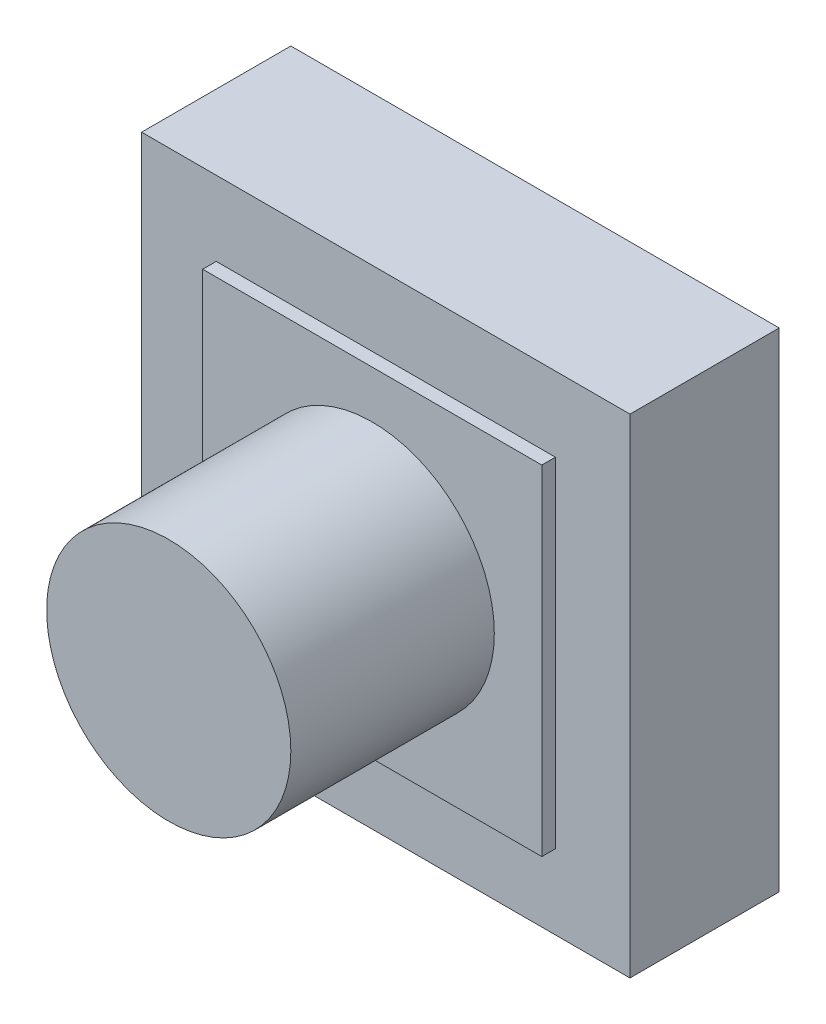
ISO-10303-21;
HEADER;
FILE_DESCRIPTION(('STEP AP214'),'2;1');
FILE_NAME('part.step','',(''),(''),'','','');
FILE_SCHEMA(('AUTOMOTIVE_DESIGN { 1 0 10303 214 1 1 1 1 }'));
ENDSEC;
DATA;
#1=APPLICATION_CONTEXT('core data for automotive mechanical design processes');
#2=APPLICATION_PROTOCOL_DEFINITION('international standard','automotive_design',2000,#1);
#3=PRODUCT_CONTEXT('',#1,'mechanical');
#4=PRODUCT('Part','Part','',(#3));
#5=PRODUCT_RELATED_PRODUCT_CATEGORY('part','',(#4));
#6=PRODUCT_DEFINITION_FORMATION('','',#4);
#7=PRODUCT_DEFINITION_CONTEXT('part definition',#1,'design');
#8=PRODUCT_DEFINITION('design','',#6,#7);
#9=PRODUCT_DEFINITION_SHAPE('','',#8);
#10=(LENGTH_UNIT() NAMED_UNIT(*) SI_UNIT(.MILLI.,.METRE.));
#11=(NAMED_UNIT(*) PLANE_ANGLE_UNIT() SI_UNIT($,.RADIAN.));
#12=(NAMED_UNIT(*) SI_UNIT($,.STERADIAN.) SOLID_ANGLE_UNIT());
#13=UNCERTAINTY_MEASURE_WITH_UNIT(LENGTH_MEASURE(1.E-05),#10,'distance_accuracy_value','');
#14=(GEOMETRIC_REPRESENTATION_CONTEXT(3) GLOBAL_UNCERTAINTY_ASSIGNED_CONTEXT((#13)) GLOBAL_UNIT_ASSIGNED_CONTEXT((#10,
#11,#12)) REPRESENTATION_CONTEXT('',''));
#15=CARTESIAN_POINT('',(0.,0.,0.));
#16=DIRECTION('',(0.,0.,1.));
#17=DIRECTION('',(1.,0.,0.));
#18=AXIS2_PLACEMENT_3D('',#15,#16,#17);
#19=CARTESIAN_POINT('',(0.,0.,11.));
#20=DIRECTION('',(0.,0.,-1.));
#21=DIRECTION('',(-1.,0.,0.));
#22=AXIS2_PLACEMENT_3D('',#19,#20,#21);
#23=PLANE('',#22);
#24=DIRECTION('',(0.,1.,0.));
#25=VECTOR('',#24,1.);
#26=CARTESIAN_POINT('',(18.,-18.,11.));
#27=LINE('',#26,#25);
#28=CARTESIAN_POINT('',(18.,-18.,11.));
#29=VERTEX_POINT('',#28);
#30=CARTESIAN_POINT('',(18.,18.,11.));
#31=VERTEX_POINT('',#30);
#32=EDGE_CURVE('E146',#29,#31,#27,.T.);
#33=ORIENTED_EDGE('',*,*,#32,.T.);
#34=DIRECTION('',(-1.,0.,0.));
#35=VECTOR('',#34,1.);
#36=CARTESIAN_POINT('',(-18.,18.,11.));
#37=LINE('',#36,#35);
#38=CARTESIAN_POINT('',(-18.,18.,11.));
#39=VERTEX_POINT('',#38);
#40=EDGE_CURVE('E150',#31,#39,#37,.T.);
#41=ORIENTED_EDGE('',*,*,#40,.T.);
#42=DIRECTION('',(0.,-1.,0.));
#43=VECTOR('',#42,1.);
#44=CARTESIAN_POINT('',(-18.,-18.,11.));
#45=LINE('',#44,#43);
#46=CARTESIAN_POINT('',(-18.,-18.,11.));
#47=VERTEX_POINT('',#46);
#48=EDGE_CURVE('E154',#39,#47,#45,.T.);
#49=ORIENTED_EDGE('',*,*,#48,.T.);
#50=DIRECTION('',(1.,0.,0.));
#51=VECTOR('',#50,1.);
#52=CARTESIAN_POINT('',(-18.,-18.,11.));
#53=LINE('',#52,#51);
#54=EDGE_CURVE('E157',#47,#29,#53,.T.);
#55=ORIENTED_EDGE('',*,*,#54,.T.);
#56=EDGE_LOOP('',(#33,#41,#49,#55));
#57=FACE_BOUND('',#56,.T.);
#58=DIRECTION('',(0.,1.,0.));
#59=VECTOR('',#58,1.);
#60=CARTESIAN_POINT('',(12.5,-12.5,11.));
#61=LINE('',#60,#59);
#62=CARTESIAN_POINT('',(12.5,-12.5,11.));
#63=VERTEX_POINT('',#62);
#64=CARTESIAN_POINT('',(12.5,12.5,11.));
#65=VERTEX_POINT('',#64);
#66=EDGE_CURVE('E62',#63,#65,#61,.T.);
#67=ORIENTED_EDGE('',*,*,#66,.F.);
#68=DIRECTION('',(1.,0.,0.));
#69=VECTOR('',#68,1.);
#70=CARTESIAN_POINT('',(-12.5,-12.5,11.));
#71=LINE('',#70,#69);
#72=CARTESIAN_POINT('',(-12.5,-12.5,11.));
#73=VERTEX_POINT('',#72);
#74=EDGE_CURVE('E66',#73,#63,#71,.T.);
#75=ORIENTED_EDGE('',*,*,#74,.F.);
#76=DIRECTION('',(0.,-1.,0.));
#77=VECTOR('',#76,1.);
#78=CARTESIAN_POINT('',(-12.5,-12.5,11.));
#79=LINE('',#78,#77);
#80=CARTESIAN_POINT('',(-12.5,12.5,11.));
#81=VERTEX_POINT('',#80);
#82=EDGE_CURVE('E356',#81,#73,#79,.T.);
#83=ORIENTED_EDGE('',*,*,#82,.F.);
#84=DIRECTION('',(-1.,0.,0.));
#85=VECTOR('',#84,1.);
#86=CARTESIAN_POINT('',(-12.5,12.5,11.));
#87=LINE('',#86,#85);
#88=EDGE_CURVE('E346',#65,#81,#87,.T.);
#89=ORIENTED_EDGE('',*,*,#88,.F.);
#90=EDGE_LOOP('',(#67,#75,#83,#89));
#91=FACE_BOUND('',#90,.T.);
#92=ADVANCED_FACE('F45',(#57,#91),#23,.F.);
#93=CARTESIAN_POINT('',(18.,-18.,11.));
#94=DIRECTION('',(-1.,0.,0.));
#95=DIRECTION('',(0.,0.,1.));
#96=AXIS2_PLACEMENT_3D('',#93,#94,#95);
#97=PLANE('',#96);
#98=DIRECTION('',(0.,1.,0.));
#99=VECTOR('',#98,1.);
#100=CARTESIAN_POINT('',(18.,-18.,0.));
#101=LINE('',#100,#99);
#102=CARTESIAN_POINT('',(18.,-18.,0.));
#103=VERTEX_POINT('',#102);
#104=CARTESIAN_POINT('',(18.,18.,0.));
#105=VERTEX_POINT('',#104);
#106=EDGE_CURVE('E135',#103,#105,#101,.T.);
#107=ORIENTED_EDGE('',*,*,#106,.T.);
#108=DIRECTION('',(0.,0.,-1.));
#109=VECTOR('',#108,1.);
#110=CARTESIAN_POINT('',(18.,18.,11.));
#111=LINE('',#110,#109);
#112=EDGE_CURVE('E49',#31,#105,#111,.T.);
#113=ORIENTED_EDGE('',*,*,#112,.F.);
#114=ORIENTED_EDGE('',*,*,#32,.F.);
#115=DIRECTION('',(0.,0.,-1.));
#116=VECTOR('',#115,1.);
#117=CARTESIAN_POINT('',(18.,-18.,11.));
#118=LINE('',#117,#116);
#119=EDGE_CURVE('E159',#29,#103,#118,.T.);
#120=ORIENTED_EDGE('',*,*,#119,.T.);
#121=EDGE_LOOP('',(#107,#113,#114,#120));
#122=FACE_BOUND('',#121,.T.);
#123=ADVANCED_FACE('F47',(#122),#97,.F.);
#124=CARTESIAN_POINT('',(-18.,18.,11.));
#125=DIRECTION('',(0.,-1.,0.));
#126=DIRECTION('',(0.,0.,-1.));
#127=AXIS2_PLACEMENT_3D('',#124,#125,#126);
#128=PLANE('',#127);
#129=DIRECTION('',(-1.,0.,0.));
#130=VECTOR('',#129,1.);
#131=CARTESIAN_POINT('',(-18.,18.,0.));
#132=LINE('',#131,#130);
#133=CARTESIAN_POINT('',(-18.,18.,0.));
#134=VERTEX_POINT('',#133);
#135=EDGE_CURVE('E140',#105,#134,#132,.T.);
#136=ORIENTED_EDGE('',*,*,#135,.T.);
#137=DIRECTION('',(0.,0.,-1.));
#138=VECTOR('',#137,1.);
#139=CARTESIAN_POINT('',(-18.,18.,11.));
#140=LINE('',#139,#138);
#141=EDGE_CURVE('E174',#39,#134,#140,.T.);
#142=ORIENTED_EDGE('',*,*,#141,.F.);
#143=ORIENTED_EDGE('',*,*,#40,.F.);
#144=ORIENTED_EDGE('',*,*,#112,.T.);
#145=EDGE_LOOP('',(#136,#142,#143,#144));
#146=FACE_BOUND('',#145,.T.);
#147=ADVANCED_FACE('F185',(#146),#128,.F.);
#148=CARTESIAN_POINT('',(-18.,-18.,11.));
#149=DIRECTION('',(1.,0.,0.));
#150=DIRECTION('',(0.,0.,-1.));
#151=AXIS2_PLACEMENT_3D('',#148,#149,#150);
#152=PLANE('',#151);
#153=DIRECTION('',(0.,-1.,0.));
#154=VECTOR('',#153,1.);
#155=CARTESIAN_POINT('',(-18.,-18.,0.));
#156=LINE('',#155,#154);
#157=CARTESIAN_POINT('',(-18.,-18.,0.));
#158=VERTEX_POINT('',#157);
#159=EDGE_CURVE('E163',#134,#158,#156,.T.);
#160=ORIENTED_EDGE('',*,*,#159,.T.);
#161=DIRECTION('',(0.,0.,-1.));
#162=VECTOR('',#161,1.);
#163=CARTESIAN_POINT('',(-18.,-18.,11.));
#164=LINE('',#163,#162);
#165=EDGE_CURVE('E171',#47,#158,#164,.T.);
#166=ORIENTED_EDGE('',*,*,#165,.F.);
#167=ORIENTED_EDGE('',*,*,#48,.F.);
#168=ORIENTED_EDGE('',*,*,#141,.T.);
#169=EDGE_LOOP('',(#160,#166,#167,#168));
#170=FACE_BOUND('',#169,.T.);
#171=ADVANCED_FACE('F194',(#170),#152,.F.);
#172=CARTESIAN_POINT('',(-18.,-18.,11.));
#173=DIRECTION('',(0.,1.,0.));
#174=DIRECTION('',(0.,0.,1.));
#175=AXIS2_PLACEMENT_3D('',#172,#173,#174);
#176=PLANE('',#175);
#177=DIRECTION('',(1.,0.,0.));
#178=VECTOR('',#177,1.);
#179=CARTESIAN_POINT('',(-18.,-18.,0.));
#180=LINE('',#179,#178);
#181=EDGE_CURVE('E151',#158,#103,#180,.T.);
#182=ORIENTED_EDGE('',*,*,#181,.T.);
#183=ORIENTED_EDGE('',*,*,#119,.F.);
#184=ORIENTED_EDGE('',*,*,#54,.F.);
#185=ORIENTED_EDGE('',*,*,#165,.T.);
#186=EDGE_LOOP('',(#182,#183,#184,#185));
#187=FACE_BOUND('',#186,.T.);
#188=ADVANCED_FACE('F197',(#187),#176,.F.);
#189=CARTESIAN_POINT('',(0.,0.,0.));
#190=DIRECTION('',(0.,0.,-1.));
#191=DIRECTION('',(-1.,0.,0.));
#192=AXIS2_PLACEMENT_3D('',#189,#190,#191);
#193=PLANE('',#192);
#194=ORIENTED_EDGE('',*,*,#106,.F.);
#195=ORIENTED_EDGE('',*,*,#181,.F.);
#196=ORIENTED_EDGE('',*,*,#159,.F.);
#197=ORIENTED_EDGE('',*,*,#135,.F.);
#198=EDGE_LOOP('',(#194,#195,#196,#197));
#199=FACE_BOUND('',#198,.T.);
#200=ADVANCED_FACE('F192',(#199),#193,.T.);
#201=CARTESIAN_POINT('',(12.5,-12.5,12.));
#202=DIRECTION('',(-1.,0.,0.));
#203=DIRECTION('',(0.,0.,1.));
#204=AXIS2_PLACEMENT_3D('',#201,#202,#203);
#205=PLANE('',#204);
#206=ORIENTED_EDGE('',*,*,#66,.T.);
#207=DIRECTION('',(0.,0.,-1.));
#208=VECTOR('',#207,1.);
#209=CARTESIAN_POINT('',(12.5,12.5,12.));
#210=LINE('',#209,#208);
#211=CARTESIAN_POINT('',(12.5,12.5,12.));
#212=VERTEX_POINT('',#211);
#213=EDGE_CURVE('E115',#212,#65,#210,.T.);
#214=ORIENTED_EDGE('',*,*,#213,.F.);
#215=DIRECTION('',(0.,1.,0.));
#216=VECTOR('',#215,1.);
#217=CARTESIAN_POINT('',(12.5,-12.5,12.));
#218=LINE('',#217,#216);
#219=CARTESIAN_POINT('',(12.5,-12.5,12.));
#220=VERTEX_POINT('',#219);
#221=EDGE_CURVE('E122',#220,#212,#218,.T.);
#222=ORIENTED_EDGE('',*,*,#221,.F.);
#223=DIRECTION('',(0.,0.,-1.));
#224=VECTOR('',#223,1.);
#225=CARTESIAN_POINT('',(12.5,-12.5,12.));
#226=LINE('',#225,#224);
#227=EDGE_CURVE('E352',#220,#63,#226,.T.);
#228=ORIENTED_EDGE('',*,*,#227,.T.);
#229=EDGE_LOOP('',(#206,#214,#222,#228));
#230=FACE_BOUND('',#229,.T.);
#231=ADVANCED_FACE('F133',(#230),#205,.F.);
#232=CARTESIAN_POINT('',(-12.5,12.5,12.));
#233=DIRECTION('',(0.,-1.,0.));
#234=DIRECTION('',(0.,0.,-1.));
#235=AXIS2_PLACEMENT_3D('',#232,#233,#234);
#236=PLANE('',#235);
#237=ORIENTED_EDGE('',*,*,#88,.T.);
#238=DIRECTION('',(0.,0.,-1.));
#239=VECTOR('',#238,1.);
#240=CARTESIAN_POINT('',(-12.5,12.5,12.));
#241=LINE('',#240,#239);
#242=CARTESIAN_POINT('',(-12.5,12.5,12.));
#243=VERTEX_POINT('',#242);
#244=EDGE_CURVE('E117',#243,#81,#241,.T.);
#245=ORIENTED_EDGE('',*,*,#244,.F.);
#246=DIRECTION('',(-1.,0.,0.));
#247=VECTOR('',#246,1.);
#248=CARTESIAN_POINT('',(-12.5,12.5,12.));
#249=LINE('',#248,#247);
#250=EDGE_CURVE('E110',#212,#243,#249,.T.);
#251=ORIENTED_EDGE('',*,*,#250,.F.);
#252=ORIENTED_EDGE('',*,*,#213,.T.);
#253=EDGE_LOOP('',(#237,#245,#251,#252));
#254=FACE_BOUND('',#253,.T.);
#255=ADVANCED_FACE('F113',(#254),#236,.F.);
#256=CARTESIAN_POINT('',(-12.5,-12.5,12.));
#257=DIRECTION('',(1.,0.,0.));
#258=DIRECTION('',(0.,0.,-1.));
#259=AXIS2_PLACEMENT_3D('',#256,#257,#258);
#260=PLANE('',#259);
#261=ORIENTED_EDGE('',*,*,#82,.T.);
#262=DIRECTION('',(0.,0.,-1.));
#263=VECTOR('',#262,1.);
#264=CARTESIAN_POINT('',(-12.5,-12.5,12.));
#265=LINE('',#264,#263);
#266=CARTESIAN_POINT('',(-12.5,-12.5,12.));
#267=VERTEX_POINT('',#266);
#268=EDGE_CURVE('E142',#267,#73,#265,.T.);
#269=ORIENTED_EDGE('',*,*,#268,.F.);
#270=DIRECTION('',(0.,-1.,0.));
#271=VECTOR('',#270,1.);
#272=CARTESIAN_POINT('',(-12.5,-12.5,12.));
#273=LINE('',#272,#271);
#274=EDGE_CURVE('E121',#243,#267,#273,.T.);
#275=ORIENTED_EDGE('',*,*,#274,.F.);
#276=ORIENTED_EDGE('',*,*,#244,.T.);
#277=EDGE_LOOP('',(#261,#269,#275,#276));
#278=FACE_BOUND('',#277,.T.);
#279=ADVANCED_FACE('F240',(#278),#260,.F.);
#280=CARTESIAN_POINT('',(-12.5,-12.5,12.));
#281=DIRECTION('',(0.,1.,0.));
#282=DIRECTION('',(0.,0.,1.));
#283=AXIS2_PLACEMENT_3D('',#280,#281,#282);
#284=PLANE('',#283);
#285=ORIENTED_EDGE('',*,*,#74,.T.);
#286=ORIENTED_EDGE('',*,*,#227,.F.);
#287=DIRECTION('',(1.,0.,0.));
#288=VECTOR('',#287,1.);
#289=CARTESIAN_POINT('',(-12.5,-12.5,12.));
#290=LINE('',#289,#288);
#291=EDGE_CURVE('E127',#267,#220,#290,.T.);
#292=ORIENTED_EDGE('',*,*,#291,.F.);
#293=ORIENTED_EDGE('',*,*,#268,.T.);
#294=EDGE_LOOP('',(#285,#286,#292,#293));
#295=FACE_BOUND('',#294,.T.);
#296=ADVANCED_FACE('F246',(#295),#284,.F.);
#297=CARTESIAN_POINT('',(0.,0.,12.));
#298=DIRECTION('',(0.,0.,-1.));
#299=DIRECTION('',(-1.,0.,0.));
#300=AXIS2_PLACEMENT_3D('',#297,#298,#299);
#301=PLANE('',#300);
#302=CARTESIAN_POINT('',(0.,0.,12.));
#303=DIRECTION('',(0.,0.,1.));
#304=DIRECTION('',(1.,0.,0.));
#305=AXIS2_PLACEMENT_3D('',#302,#303,#304);
#306=CIRCLE('',#305,9.);
#307=CARTESIAN_POINT('',(9.,0.,12.));
#308=VERTEX_POINT('',#307);
#309=EDGE_CURVE('E11',#308,#308,#306,.T.);
#310=ORIENTED_EDGE('',*,*,#309,.F.);
#311=EDGE_LOOP('',(#310));
#312=FACE_BOUND('',#311,.T.);
#313=ORIENTED_EDGE('',*,*,#221,.T.);
#314=ORIENTED_EDGE('',*,*,#250,.T.);
#315=ORIENTED_EDGE('',*,*,#274,.T.);
#316=ORIENTED_EDGE('',*,*,#291,.T.);
#317=EDGE_LOOP('',(#313,#314,#315,#316));
#318=FACE_BOUND('',#317,.T.);
#319=ADVANCED_FACE('F125',(#312,#318),#301,.F.);
#320=CARTESIAN_POINT('',(0.,0.,27.));
#321=DIRECTION('',(0.,0.,-1.));
#322=DIRECTION('',(-1.,0.,0.));
#323=AXIS2_PLACEMENT_3D('',#320,#321,#322);
#324=CYLINDRICAL_SURFACE('',#323,9.);
#325=CARTESIAN_POINT('',(0.,0.,27.));
#326=DIRECTION('',(0.,0.,1.));
#327=DIRECTION('',(1.,0.,0.));
#328=AXIS2_PLACEMENT_3D('',#325,#326,#327);
#329=CIRCLE('',#328,9.);
#330=CARTESIAN_POINT('',(9.,0.,27.));
#331=VERTEX_POINT('',#330);
#332=EDGE_CURVE('E342',#331,#331,#329,.T.);
#333=ORIENTED_EDGE('',*,*,#332,.F.);
#334=EDGE_LOOP('',(#333));
#335=FACE_BOUND('',#334,.T.);
#336=ORIENTED_EDGE('',*,*,#309,.T.);
#337=EDGE_LOOP('',(#336));
#338=FACE_BOUND('',#337,.T.);
#339=ADVANCED_FACE('F262',(#335,#338),#324,.T.);
#340=CARTESIAN_POINT('',(0.,0.,27.));
#341=DIRECTION('',(0.,0.,1.));
#342=DIRECTION('',(1.,0.,0.));
#343=AXIS2_PLACEMENT_3D('',#340,#341,#342);
#344=PLANE('',#343);
#345=ORIENTED_EDGE('',*,*,#332,.T.);
#346=EDGE_LOOP('',(#345));
#347=FACE_BOUND('',#346,.T.);
#348=ADVANCED_FACE('F270',(#347),#344,.T.);
#349=CLOSED_SHELL('',(#92,#123,#147,#171,#188,#200,#231,#255,#279,#296,#319,#339,#348));
#350=MANIFOLD_SOLID_BREP('B2',#349);
#351=ADVANCED_BREP_SHAPE_REPRESENTATION('',(#18,#350),#14);
#352=SHAPE_DEFINITION_REPRESENTATION(#9,#351);
ENDSEC;
END-ISO-10303-21;
